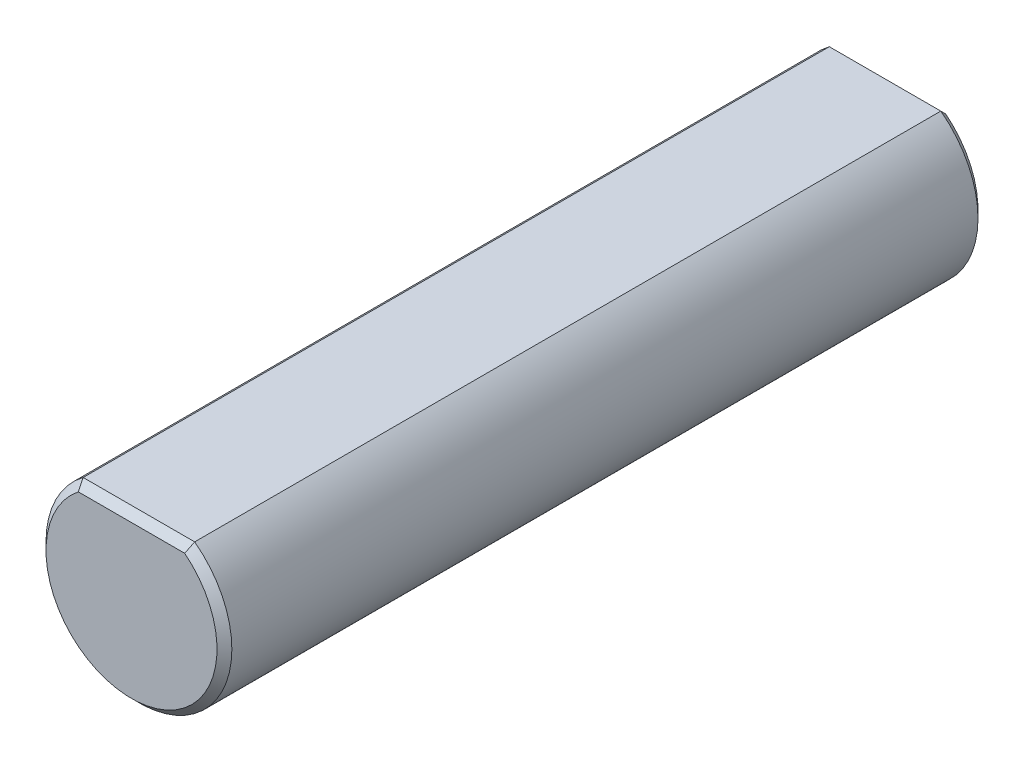
ISO-10303-21;
HEADER;
FILE_DESCRIPTION(('STEP AP214'),'2;1');
FILE_NAME('part.step','',(''),(''),'','','');
FILE_SCHEMA(('AUTOMOTIVE_DESIGN { 1 0 10303 214 1 1 1 1 }'));
ENDSEC;
DATA;
#1=APPLICATION_CONTEXT('core data for automotive mechanical design processes');
#2=APPLICATION_PROTOCOL_DEFINITION('international standard','automotive_design',2000,#1);
#3=PRODUCT_CONTEXT('',#1,'mechanical');
#4=PRODUCT('Part','Part','',(#3));
#5=PRODUCT_RELATED_PRODUCT_CATEGORY('part','',(#4));
#6=PRODUCT_DEFINITION_FORMATION('','',#4);
#7=PRODUCT_DEFINITION_CONTEXT('part definition',#1,'design');
#8=PRODUCT_DEFINITION('design','',#6,#7);
#9=PRODUCT_DEFINITION_SHAPE('','',#8);
#10=(LENGTH_UNIT() NAMED_UNIT(*) SI_UNIT(.MILLI.,.METRE.));
#11=(NAMED_UNIT(*) PLANE_ANGLE_UNIT() SI_UNIT($,.RADIAN.));
#12=(NAMED_UNIT(*) SI_UNIT($,.STERADIAN.) SOLID_ANGLE_UNIT());
#13=UNCERTAINTY_MEASURE_WITH_UNIT(LENGTH_MEASURE(1.E-05),#10,'distance_accuracy_value','');
#14=(GEOMETRIC_REPRESENTATION_CONTEXT(3) GLOBAL_UNCERTAINTY_ASSIGNED_CONTEXT((#13)) GLOBAL_UNIT_ASSIGNED_CONTEXT((#10,
#11,#12)) REPRESENTATION_CONTEXT('',''));
#15=CARTESIAN_POINT('',(0.,0.,0.));
#16=DIRECTION('',(0.,0.,1.));
#17=DIRECTION('',(1.,0.,0.));
#18=AXIS2_PLACEMENT_3D('',#15,#16,#17);
#19=CARTESIAN_POINT('',(0.,0.,13.));
#20=DIRECTION('',(0.,0.,-1.));
#21=DIRECTION('',(-1.,0.,0.));
#22=AXIS2_PLACEMENT_3D('',#19,#20,#21);
#23=CYLINDRICAL_SURFACE('',#22,3.175);
#24=DIRECTION('',(0.,0.,-1.));
#25=VECTOR('',#24,1.);
#26=CARTESIAN_POINT('',(1.905,2.54,13.));
#27=LINE('',#26,#25);
#28=CARTESIAN_POINT('',(1.905,2.54,12.746));
#29=VERTEX_POINT('',#28);
#30=CARTESIAN_POINT('',(1.905,2.54,-12.746));
#31=VERTEX_POINT('',#30);
#32=EDGE_CURVE('E104',#29,#31,#27,.T.);
#33=ORIENTED_EDGE('',*,*,#32,.F.);
#34=CARTESIAN_POINT('',(0.,0.,12.746));
#35=DIRECTION('',(0.,0.,1.));
#36=DIRECTION('',(1.,0.,0.));
#37=AXIS2_PLACEMENT_3D('',#34,#35,#36);
#38=CIRCLE('',#37,3.175);
#39=CARTESIAN_POINT('',(-1.905,2.54,12.746));
#40=VERTEX_POINT('',#39);
#41=EDGE_CURVE('E120',#29,#40,#38,.F.);
#42=ORIENTED_EDGE('',*,*,#41,.T.);
#43=DIRECTION('',(0.,0.,-1.));
#44=VECTOR('',#43,1.);
#45=CARTESIAN_POINT('',(-1.905,2.54,13.));
#46=LINE('',#45,#44);
#47=CARTESIAN_POINT('',(-1.905,2.54,-12.746));
#48=VERTEX_POINT('',#47);
#49=EDGE_CURVE('E156',#40,#48,#46,.T.);
#50=ORIENTED_EDGE('',*,*,#49,.T.);
#51=CARTESIAN_POINT('',(0.,0.,-12.746));
#52=DIRECTION('',(0.,0.,1.));
#53=DIRECTION('',(1.,0.,0.));
#54=AXIS2_PLACEMENT_3D('',#51,#52,#53);
#55=CIRCLE('',#54,3.175);
#56=EDGE_CURVE('E117',#48,#31,#55,.T.);
#57=ORIENTED_EDGE('',*,*,#56,.T.);
#58=EDGE_LOOP('',(#33,#42,#50,#57));
#59=FACE_BOUND('',#58,.T.);
#60=ADVANCED_FACE('F39',(#59),#23,.T.);
#61=CARTESIAN_POINT('',(1.905,2.54,13.));
#62=DIRECTION('',(0.,-1.,0.));
#63=DIRECTION('',(0.,0.,-1.));
#64=AXIS2_PLACEMENT_3D('',#61,#62,#63);
#65=PLANE('',#64);
#66=ORIENTED_EDGE('',*,*,#49,.F.);
#67=DIRECTION('',(1.,0.,0.));
#68=VECTOR('',#67,1.);
#69=CARTESIAN_POINT('',(1.905,2.54,12.746));
#70=LINE('',#69,#68);
#71=EDGE_CURVE('E93',#40,#29,#70,.T.);
#72=ORIENTED_EDGE('',*,*,#71,.T.);
#73=ORIENTED_EDGE('',*,*,#32,.T.);
#74=DIRECTION('',(-1.,0.,0.));
#75=VECTOR('',#74,1.);
#76=CARTESIAN_POINT('',(1.905,2.54,-12.746));
#77=LINE('',#76,#75);
#78=EDGE_CURVE('E108',#31,#48,#77,.T.);
#79=ORIENTED_EDGE('',*,*,#78,.T.);
#80=EDGE_LOOP('',(#66,#72,#73,#79));
#81=FACE_BOUND('',#80,.T.);
#82=ADVANCED_FACE('F164',(#81),#65,.F.);
#83=CARTESIAN_POINT('',(0.,0.,13.));
#84=DIRECTION('',(0.,0.,1.));
#85=DIRECTION('',(1.,0.,0.));
#86=AXIS2_PLACEMENT_3D('',#83,#84,#85);
#87=PLANE('',#86);
#88=CARTESIAN_POINT('',(0.,0.,13.));
#89=DIRECTION('',(0.,0.,1.));
#90=DIRECTION('',(1.,0.,0.));
#91=AXIS2_PLACEMENT_3D('',#88,#89,#90);
#92=CIRCLE('',#91,2.92100000000001);
#93=CARTESIAN_POINT('',(-1.81836327503614,2.28599999999997,13.));
#94=VERTEX_POINT('',#93);
#95=CARTESIAN_POINT('',(1.81836327503614,2.28599999999997,13.));
#96=VERTEX_POINT('',#95);
#97=EDGE_CURVE('E100',#94,#96,#92,.T.);
#98=ORIENTED_EDGE('',*,*,#97,.T.);
#99=DIRECTION('',(-1.,0.,0.));
#100=VECTOR('',#99,1.);
#101=CARTESIAN_POINT('',(-1.905,2.28600000000001,13.));
#102=LINE('',#101,#100);
#103=EDGE_CURVE('E91',#96,#94,#102,.T.);
#104=ORIENTED_EDGE('',*,*,#103,.T.);
#105=EDGE_LOOP('',(#98,#104));
#106=FACE_BOUND('',#105,.T.);
#107=ADVANCED_FACE('F106',(#106),#87,.T.);
#108=CARTESIAN_POINT('',(0.,0.,-13.));
#109=DIRECTION('',(0.,0.,1.));
#110=DIRECTION('',(1.,0.,0.));
#111=AXIS2_PLACEMENT_3D('',#108,#109,#110);
#112=PLANE('',#111);
#113=CARTESIAN_POINT('',(0.,0.,-13.));
#114=DIRECTION('',(0.,0.,1.));
#115=DIRECTION('',(1.,0.,0.));
#116=AXIS2_PLACEMENT_3D('',#113,#114,#115);
#117=CIRCLE('',#116,2.92099999999998);
#118=CARTESIAN_POINT('',(1.81836327503613,2.28599999999994,-13.));
#119=VERTEX_POINT('',#118);
#120=CARTESIAN_POINT('',(-1.81836327503613,2.28599999999994,-13.));
#121=VERTEX_POINT('',#120);
#122=EDGE_CURVE('E54',#119,#121,#117,.F.);
#123=ORIENTED_EDGE('',*,*,#122,.T.);
#124=DIRECTION('',(1.,0.,0.));
#125=VECTOR('',#124,1.);
#126=CARTESIAN_POINT('',(0.,2.28599999999998,-13.));
#127=LINE('',#126,#125);
#128=EDGE_CURVE('E11',#121,#119,#127,.T.);
#129=ORIENTED_EDGE('',*,*,#128,.T.);
#130=EDGE_LOOP('',(#123,#129));
#131=FACE_BOUND('',#130,.T.);
#132=ADVANCED_FACE('F175',(#131),#112,.F.);
#133=CARTESIAN_POINT('',(0.,0.,13.));
#134=DIRECTION('',(0.,0.,-1.));
#135=DIRECTION('',(-1.,0.,0.));
#136=AXIS2_PLACEMENT_3D('',#133,#134,#135);
#137=CONICAL_SURFACE('',#136,2.92100000000001,0.785398163397451);
#138=CARTESIAN_POINT('',(-1.81836327503617,2.28600000000001,13.));
#139=CARTESIAN_POINT('',(-1.8331202081611,2.32827920209276,12.9577207979072));
#140=CARTESIAN_POINT('',(-1.84771840387271,2.37058547601539,12.9154145239846));
#141=CARTESIAN_POINT('',(-1.87659731200799,2.45525214271377,12.8307478572862));
#142=CARTESIAN_POINT('',(-1.8908780246177,2.4976125354578,12.7883874645422));
#143=CARTESIAN_POINT('',(-1.90500000000012,2.53999999999998,12.746));
#144=B_SPLINE_CURVE_WITH_KNOTS('',3,(#138,#139,#140,#141,#142,#143),.UNSPECIFIED.,.F.,.F.,(4,2,
4),(0.,0.184755894358469,0.369511680453219),.UNSPECIFIED.);
#145=EDGE_CURVE('E87',#40,#94,#144,.F.);
#146=ORIENTED_EDGE('',*,*,#145,.F.);
#147=ORIENTED_EDGE('',*,*,#41,.F.);
#148=CARTESIAN_POINT('',(1.905,2.54,12.746));
#149=CARTESIAN_POINT('',(1.89087802461764,2.49761253545782,12.7883874645422));
#150=CARTESIAN_POINT('',(1.87659731200796,2.45525214271377,12.8307478572862));
#151=CARTESIAN_POINT('',(1.84771840387273,2.37058547601538,12.9154145239846));
#152=CARTESIAN_POINT('',(1.83312020816114,2.32827920209275,12.9577207979072));
#153=CARTESIAN_POINT('',(1.81836327503621,2.286,13.));
#154=B_SPLINE_CURVE_WITH_KNOTS('',3,(#148,#149,#150,#151,#152,#153),.UNSPECIFIED.,.F.,.F.,(4,2,
4),(0.,0.18475578609475,0.369511680453219),.UNSPECIFIED.);
#155=EDGE_CURVE('E97',#96,#29,#154,.F.);
#156=ORIENTED_EDGE('',*,*,#155,.F.);
#157=ORIENTED_EDGE('',*,*,#97,.F.);
#158=EDGE_LOOP('',(#146,#147,#156,#157));
#159=FACE_BOUND('',#158,.T.);
#160=ADVANCED_FACE('F101',(#159),#137,.T.);
#161=CARTESIAN_POINT('',(0.,2.28600000000001,13.));
#162=DIRECTION('',(0.,0.707106781186546,0.707106781186549));
#163=DIRECTION('',(1.,0.,0.));
#164=AXIS2_PLACEMENT_3D('',#161,#162,#163);
#165=PLANE('',#164);
#166=ORIENTED_EDGE('',*,*,#155,.T.);
#167=ORIENTED_EDGE('',*,*,#71,.F.);
#168=ORIENTED_EDGE('',*,*,#145,.T.);
#169=ORIENTED_EDGE('',*,*,#103,.F.);
#170=EDGE_LOOP('',(#166,#167,#168,#169));
#171=FACE_BOUND('',#170,.T.);
#172=ADVANCED_FACE('F89',(#171),#165,.T.);
#173=CARTESIAN_POINT('',(0.,0.,-12.746));
#174=DIRECTION('',(0.,0.,1.));
#175=DIRECTION('',(1.,0.,0.));
#176=AXIS2_PLACEMENT_3D('',#173,#174,#175);
#177=CONICAL_SURFACE('',#176,3.175,0.785398163397461);
#178=CARTESIAN_POINT('',(-1.905,2.54,-12.746));
#179=CARTESIAN_POINT('',(-1.89087802461763,2.49761253545781,-12.7883874645422));
#180=CARTESIAN_POINT('',(-1.87659731200796,2.45525214271376,-12.8307478572862));
#181=CARTESIAN_POINT('',(-1.84771840387273,2.37058547601536,-12.9154145239846));
#182=CARTESIAN_POINT('',(-1.83312020816113,2.32827920209273,-12.9577207979072));
#183=CARTESIAN_POINT('',(-1.8183632750362,2.28599999999997,-13.));
#184=B_SPLINE_CURVE_WITH_KNOTS('',3,(#178,#179,#180,#181,#182,#183),.UNSPECIFIED.,.F.,.F.,(4,2,
4),(0.,0.184755786094769,0.369511680453256),.UNSPECIFIED.);
#185=EDGE_CURVE('E145',#121,#48,#184,.F.);
#186=ORIENTED_EDGE('',*,*,#185,.F.);
#187=ORIENTED_EDGE('',*,*,#122,.F.);
#188=CARTESIAN_POINT('',(1.81836327503616,2.28599999999998,-13.));
#189=CARTESIAN_POINT('',(1.8331202081611,2.32827920209274,-12.9577207979072));
#190=CARTESIAN_POINT('',(1.8477184038727,2.37058547601537,-12.9154145239846));
#191=CARTESIAN_POINT('',(1.87659731200799,2.45525214271376,-12.8307478572862));
#192=CARTESIAN_POINT('',(1.8908780246177,2.4976125354578,-12.7883874645422));
#193=CARTESIAN_POINT('',(1.90500000000012,2.53999999999998,-12.746));
#194=B_SPLINE_CURVE_WITH_KNOTS('',3,(#188,#189,#190,#191,#192,#193),.UNSPECIFIED.,.F.,.F.,(4,2,
4),(0.,0.184755894358487,0.369511680453255),.UNSPECIFIED.);
#195=EDGE_CURVE('E44',#31,#119,#194,.F.);
#196=ORIENTED_EDGE('',*,*,#195,.F.);
#197=ORIENTED_EDGE('',*,*,#56,.F.);
#198=EDGE_LOOP('',(#186,#187,#196,#197));
#199=FACE_BOUND('',#198,.T.);
#200=ADVANCED_FACE('F139',(#199),#177,.T.);
#201=CARTESIAN_POINT('',(1.905,2.54,-12.746));
#202=DIRECTION('',(0.,-0.707106781186538,0.707106781186557));
#203=DIRECTION('',(-1.,0.,0.));
#204=AXIS2_PLACEMENT_3D('',#201,#202,#203);
#205=PLANE('',#204);
#206=ORIENTED_EDGE('',*,*,#195,.T.);
#207=ORIENTED_EDGE('',*,*,#128,.F.);
#208=ORIENTED_EDGE('',*,*,#185,.T.);
#209=ORIENTED_EDGE('',*,*,#78,.F.);
#210=EDGE_LOOP('',(#206,#207,#208,#209));
#211=FACE_BOUND('',#210,.T.);
#212=ADVANCED_FACE('F41',(#211),#205,.F.);
#213=CLOSED_SHELL('',(#60,#82,#107,#132,#160,#172,#200,#212));
#214=MANIFOLD_SOLID_BREP('B2',#213);
#215=ADVANCED_BREP_SHAPE_REPRESENTATION('',(#18,#214),#14);
#216=SHAPE_DEFINITION_REPRESENTATION(#9,#215);
ENDSEC;
END-ISO-10303-21;
